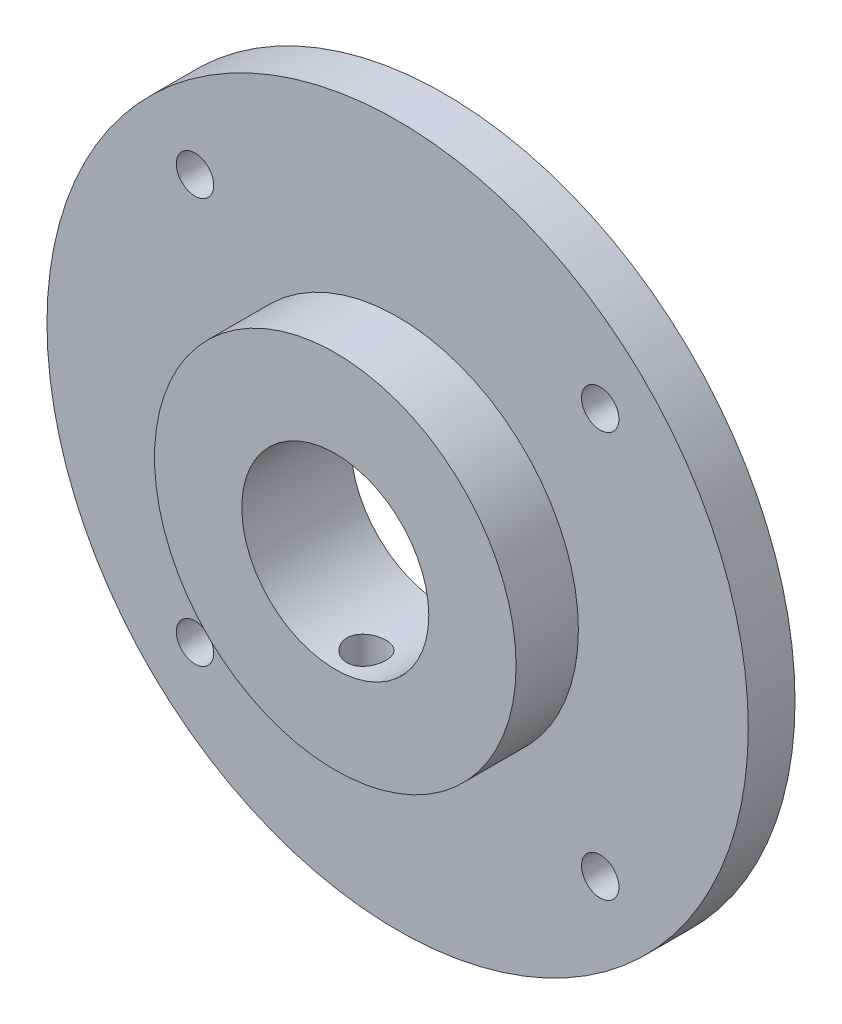
ISO-10303-21;
HEADER;
FILE_DESCRIPTION(('STEP AP214'),'2;1');
FILE_NAME('part.step','',(''),(''),'','','');
FILE_SCHEMA(('AUTOMOTIVE_DESIGN { 1 0 10303 214 1 1 1 1 }'));
ENDSEC;
DATA;
#1=APPLICATION_CONTEXT('core data for automotive mechanical design processes');
#2=APPLICATION_PROTOCOL_DEFINITION('international standard','automotive_design',2000,#1);
#3=PRODUCT_CONTEXT('',#1,'mechanical');
#4=PRODUCT('Part','Part','',(#3));
#5=PRODUCT_RELATED_PRODUCT_CATEGORY('part','',(#4));
#6=PRODUCT_DEFINITION_FORMATION('','',#4);
#7=PRODUCT_DEFINITION_CONTEXT('part definition',#1,'design');
#8=PRODUCT_DEFINITION('design','',#6,#7);
#9=PRODUCT_DEFINITION_SHAPE('','',#8);
#10=(LENGTH_UNIT() NAMED_UNIT(*) SI_UNIT(.MILLI.,.METRE.));
#11=(NAMED_UNIT(*) PLANE_ANGLE_UNIT() SI_UNIT($,.RADIAN.));
#12=(NAMED_UNIT(*) SI_UNIT($,.STERADIAN.) SOLID_ANGLE_UNIT());
#13=UNCERTAINTY_MEASURE_WITH_UNIT(LENGTH_MEASURE(1.E-05),#10,'distance_accuracy_value','');
#14=(GEOMETRIC_REPRESENTATION_CONTEXT(3) GLOBAL_UNCERTAINTY_ASSIGNED_CONTEXT((#13)) GLOBAL_UNIT_ASSIGNED_CONTEXT((#10,
#11,#12)) REPRESENTATION_CONTEXT('',''));
#15=CARTESIAN_POINT('',(0.,0.,0.));
#16=DIRECTION('',(0.,0.,1.));
#17=DIRECTION('',(1.,0.,0.));
#18=AXIS2_PLACEMENT_3D('',#15,#16,#17);
#19=CARTESIAN_POINT('',(5.44999999999901,10.5000000000004,7.2));
#20=DIRECTION('',(0.,0.,-1.));
#21=DIRECTION('',(-1.,0.,0.));
#22=AXIS2_PLACEMENT_3D('',#19,#20,#21);
#23=CYLINDRICAL_SURFACE('',#22,11.6);
#24=CARTESIAN_POINT('',(5.44999999999901,-1.09999999999963,6.25));
#25=CARTESIAN_POINT('',(5.51999533700662,-1.09999913909534,6.24999698414102));
#26=CARTESIAN_POINT('',(5.59003622514898,-1.09935974353205,6.24410098054191));
#27=CARTESIAN_POINT('',(5.72817413146121,-1.09687055638668,6.22067083736708));
#28=CARTESIAN_POINT('',(5.79626895634239,-1.09501945127631,6.20312406772643));
#29=CARTESIAN_POINT('',(5.92849451545237,-1.09031568143509,6.15691093620705));
#30=CARTESIAN_POINT('',(5.99262769398796,-1.08746364168106,6.12825151182667));
#31=CARTESIAN_POINT('',(6.1151601117815,-1.08107642052906,6.06064058602222));
#32=CARTESIAN_POINT('',(6.17356044315951,-1.07754136962858,6.02169105012624));
#33=CARTESIAN_POINT('',(6.28322505060999,-1.07016735079525,5.93443240990416));
#34=CARTESIAN_POINT('',(6.33446218062447,-1.06632730885086,5.88608927653775));
#35=CARTESIAN_POINT('',(6.42811248252506,-1.05878492070924,5.781488495025));
#36=CARTESIAN_POINT('',(6.4705252348429,-1.05508258106613,5.72523047076635));
#37=CARTESIAN_POINT('',(6.54542058366156,-1.04822396428384,5.60622486904517));
#38=CARTESIAN_POINT('',(6.57787833948106,-1.04506906153671,5.54346157226251));
#39=CARTESIAN_POINT('',(6.63178372408223,-1.03967614299403,5.41333576894798));
#40=CARTESIAN_POINT('',(6.65323166622358,-1.03743810110328,5.34597339337623));
#41=CARTESIAN_POINT('',(6.68442746674451,-1.03414220747002,5.20884011316874));
#42=CARTESIAN_POINT('',(6.69422062261861,-1.03307978769286,5.13907962469678));
#43=CARTESIAN_POINT('',(6.70196892377787,-1.0322413190753,4.99889772296499));
#44=CARTESIAN_POINT('',(6.69992442732175,-1.0324652313049,4.9284763297714));
#45=CARTESIAN_POINT('',(6.68409274956151,-1.03416995202075,4.78928485246713));
#46=CARTESIAN_POINT('',(6.67035515140598,-1.03564545320838,4.72050905458874));
#47=CARTESIAN_POINT('',(6.63160444135702,-1.03967881584656,4.58624487457389));
#48=CARTESIAN_POINT('',(6.60659115512832,-1.04223669403189,4.52075654328291));
#49=CARTESIAN_POINT('',(6.54594478743424,-1.04815268796088,4.39477038241008));
#50=CARTESIAN_POINT('',(6.51028983753168,-1.05151244868342,4.33428316009557));
#51=CARTESIAN_POINT('',(6.42938794828955,-1.05865229615894,4.22013234564498));
#52=CARTESIAN_POINT('',(6.38414068276848,-1.06243239720327,4.16646898564996));
#53=CARTESIAN_POINT('',(6.2850622461858,-1.07001064283307,4.06720116902675));
#54=CARTESIAN_POINT('',(6.23118827744613,-1.07380878062127,4.02163941700526));
#55=CARTESIAN_POINT('',(6.1165339675401,-1.08097690837796,3.94019957331797));
#56=CARTESIAN_POINT('',(6.05575361660819,-1.08434689774104,3.90432149534501));
#57=CARTESIAN_POINT('',(5.92898132579146,-1.09028039382145,3.84326866076262));
#58=CARTESIAN_POINT('',(5.86298826377034,-1.09284372629522,3.81809621623313));
#59=CARTESIAN_POINT('',(5.72767844536308,-1.0968733805983,3.77920124351773));
#60=CARTESIAN_POINT('',(5.65836180453735,-1.09833974053982,3.76547831753835));
#61=CARTESIAN_POINT('',(5.51874212889057,-1.10000531984257,3.74992643737613));
#62=CARTESIAN_POINT('',(5.44844572655148,-1.10021081406365,3.7480385834182));
#63=CARTESIAN_POINT('',(5.30853754397254,-1.09934836741802,3.75605552590914));
#64=CARTESIAN_POINT('',(5.23892575298107,-1.09828044658222,3.76596013686182));
#65=CARTESIAN_POINT('',(5.10253390593631,-1.09499514571276,3.79723196865486));
#66=CARTESIAN_POINT('',(5.03574742076722,-1.09278054621711,3.81857146581906));
#67=CARTESIAN_POINT('',(4.90670179650484,-1.08745017954791,3.87207873423338));
#68=CARTESIAN_POINT('',(4.8444427743081,-1.08433438911645,3.90424678495002));
#69=CARTESIAN_POINT('',(4.725954004709,-1.07753417468108,3.97864307427262));
#70=CARTESIAN_POINT('',(4.66974857333745,-1.07384759252494,4.02090983979928));
#71=CARTESIAN_POINT('',(4.56520895006475,-1.06632599269444,4.11424873231808));
#72=CARTESIAN_POINT('',(4.51687498834959,-1.06249097068331,4.16532111672375));
#73=CARTESIAN_POINT('',(4.42924453179657,-1.05508570058197,4.27507920558456));
#74=CARTESIAN_POINT('',(4.38998680614846,-1.0515166309095,4.33379595403951));
#75=CARTESIAN_POINT('',(4.32189009611166,-1.04506574212863,4.45702361725961));
#76=CARTESIAN_POINT('',(4.29305094962644,-1.0421839123281,4.52153444185864));
#77=CARTESIAN_POINT('',(4.24667433002203,-1.03744137126592,4.65438833767024));
#78=CARTESIAN_POINT('',(4.22911413747143,-1.0355786084065,4.72272340168739));
#79=CARTESIAN_POINT('',(4.20572032729194,-1.0330788924812,4.86139334075567));
#80=CARTESIAN_POINT('',(4.19988631401621,-1.03244189805735,4.93172814825331));
#81=CARTESIAN_POINT('',(4.20011646354266,-1.03246681390851,5.07201560492263));
#82=CARTESIAN_POINT('',(4.20611972615156,-1.03312207581038,5.14196836311109));
#83=CARTESIAN_POINT('',(4.22972596074652,-1.03564346396097,5.2798651600132));
#84=CARTESIAN_POINT('',(4.24732894282188,-1.03750959126288,5.34780919697963));
#85=CARTESIAN_POINT('',(4.29361746419193,-1.0422405405497,5.47975720247764));
#86=CARTESIAN_POINT('',(4.32230087873798,-1.0451051710545,5.54376192367366));
#87=CARTESIAN_POINT('',(4.38992989918408,-1.05151072475119,5.66605865432032));
#88=CARTESIAN_POINT('',(4.42887550155979,-1.05505164771083,5.72435066573287));
#89=CARTESIAN_POINT('',(4.51615146325082,-1.06243265368263,5.83387927626995));
#90=CARTESIAN_POINT('',(4.56452724301535,-1.06627412843251,5.88507959050539));
#91=CARTESIAN_POINT('',(4.66919843791631,-1.07381078694458,5.97866124276079));
#92=CARTESIAN_POINT('',(4.72549573806302,-1.07750593561796,6.021040475742));
#93=CARTESIAN_POINT('',(4.84459218978712,-1.08434489488504,6.09587566134801));
#94=CARTESIAN_POINT('',(4.90740957727063,-1.08748708905908,6.12830272040164));
#95=CARTESIAN_POINT('',(5.03759307025252,-1.0928489761686,6.18210418634773));
#96=CARTESIAN_POINT('',(5.1049540046877,-1.09506969791506,6.2034909261508));
#97=CARTESIAN_POINT('',(5.21890604013171,-1.09778688149641,6.2293326275717));
#98=CARTESIAN_POINT('',(5.26477132252117,-1.09861288172304,6.23707214750509));
#99=CARTESIAN_POINT('',(5.35708438004581,-1.09971972538161,6.24740682197864));
#100=CARTESIAN_POINT('',(5.40353215227872,-1.10000057152869,6.25000200214017));
#101=CARTESIAN_POINT('',(5.44999999999901,-1.09999999999963,6.25));
#102=B_SPLINE_CURVE_WITH_KNOTS('',3,(#24,#25,#26,#27,#28,#29,#30,#31,#32,#33,#34,#35,#36,#37,
#38,#39,#40,#41,#42,#43,#44,#45,#46,#47,#48,#49,#50,#51,#52,#53,#54,#55,#56,#57,#58,#59,#60,#61,
#62,#63,#64,#65,#66,#67,#68,#69,#70,#71,#72,#73,#74,#75,#76,#77,#78,#79,#80,#81,#82,#83,#84,#85,
#86,#87,#88,#89,#90,#91,#92,#93,#94,#95,#96,#97,#98,#99,#100,#101),.UNSPECIFIED.,.T.,.F.,(4,2,2,
2,2,2,2,2,2,2,2,2,2,2,2,2,2,2,2,2,2,2,2,2,2,2,2,2,2,2,2,2,2,2,2,2,2,2,4),(0.,0.209816314099416,
0.419860452673369,0.629773673761197,0.839646827994656,1.05029493638671,1.26095305807178,
1.47213263632785,1.68330620368901,1.89365631515188,2.10400006054102,2.31345628751777,
2.52291575304307,2.73280865307758,2.94270869155187,3.15368430254348,3.36466021185602,
3.57568166221646,3.78669578070094,3.99665890296916,4.20661872254815,4.41607178635394,
4.62553025620089,4.83580094799978,5.04607778765716,5.25723688192728,5.46839269075591,
5.67912181898861,5.88984383700132,6.09948456478155,6.30912547490511,6.51872620489081,
6.72832686289343,6.93896318483017,7.14964971496033,7.36094225585737,7.57199825270133,
7.71128983280416,7.85058071916343),.UNSPECIFIED.);
#103=CARTESIAN_POINT('',(5.44999999999901,-1.09999999999963,6.25));
#104=VERTEX_POINT('',#103);
#105=EDGE_CURVE('E169',#104,#104,#102,.T.);
#106=ORIENTED_EDGE('',*,*,#105,.T.);
#107=EDGE_LOOP('',(#106));
#108=FACE_BOUND('',#107,.T.);
#109=CARTESIAN_POINT('',(5.44999999999901,10.5000000000004,3.));
#110=DIRECTION('',(0.,0.,1.));
#111=DIRECTION('',(1.,0.,0.));
#112=AXIS2_PLACEMENT_3D('',#109,#110,#111);
#113=CIRCLE('',#112,11.6);
#114=CARTESIAN_POINT('',(17.049999999999,10.5000000000004,3.));
#115=VERTEX_POINT('',#114);
#116=EDGE_CURVE('E90',#115,#115,#113,.T.);
#117=ORIENTED_EDGE('',*,*,#116,.T.);
#118=EDGE_LOOP('',(#117));
#119=FACE_BOUND('',#118,.T.);
#120=CARTESIAN_POINT('',(5.44999999999901,10.5000000000004,7.));
#121=DIRECTION('',(0.,0.,1.));
#122=DIRECTION('',(1.,0.,0.));
#123=AXIS2_PLACEMENT_3D('',#120,#121,#122);
#124=CIRCLE('',#123,11.6);
#125=CARTESIAN_POINT('',(17.049999999999,10.5000000000004,7.));
#126=VERTEX_POINT('',#125);
#127=EDGE_CURVE('E191',#126,#126,#124,.T.);
#128=ORIENTED_EDGE('',*,*,#127,.F.);
#129=EDGE_LOOP('',(#128));
#130=FACE_BOUND('',#129,.T.);
#131=ADVANCED_FACE('F61',(#108,#119,#130),#23,.T.);
#132=CARTESIAN_POINT('',(18.45,-2.49999999999999,3.));
#133=DIRECTION('',(0.,0.,-1.));
#134=DIRECTION('',(-1.,0.,0.));
#135=AXIS2_PLACEMENT_3D('',#132,#133,#134);
#136=CYLINDRICAL_SURFACE('',#135,1.2);
#137=CARTESIAN_POINT('',(18.45,-2.49999999999999,3.));
#138=DIRECTION('',(0.,0.,1.));
#139=DIRECTION('',(1.,0.,0.));
#140=AXIS2_PLACEMENT_3D('',#137,#138,#139);
#141=CIRCLE('',#140,1.2);
#142=CARTESIAN_POINT('',(19.65,-2.49999999999999,3.));
#143=VERTEX_POINT('',#142);
#144=EDGE_CURVE('E75',#143,#143,#141,.T.);
#145=ORIENTED_EDGE('',*,*,#144,.T.);
#146=EDGE_LOOP('',(#145));
#147=FACE_BOUND('',#146,.T.);
#148=CARTESIAN_POINT('',(18.45,-2.49999999999999,0.));
#149=DIRECTION('',(0.,0.,1.));
#150=DIRECTION('',(1.,0.,0.));
#151=AXIS2_PLACEMENT_3D('',#148,#149,#150);
#152=CIRCLE('',#151,1.2);
#153=CARTESIAN_POINT('',(19.65,-2.49999999999999,0.));
#154=VERTEX_POINT('',#153);
#155=EDGE_CURVE('E102',#154,#154,#152,.T.);
#156=ORIENTED_EDGE('',*,*,#155,.F.);
#157=EDGE_LOOP('',(#156));
#158=FACE_BOUND('',#157,.T.);
#159=ADVANCED_FACE('F138',(#147,#158),#136,.F.);
#160=CARTESIAN_POINT('',(18.45,23.5,3.));
#161=DIRECTION('',(0.,0.,-1.));
#162=DIRECTION('',(-1.,0.,0.));
#163=AXIS2_PLACEMENT_3D('',#160,#161,#162);
#164=CYLINDRICAL_SURFACE('',#163,1.2);
#165=CARTESIAN_POINT('',(18.45,23.5,3.));
#166=DIRECTION('',(0.,0.,1.));
#167=DIRECTION('',(1.,0.,0.));
#168=AXIS2_PLACEMENT_3D('',#165,#166,#167);
#169=CIRCLE('',#168,1.2);
#170=CARTESIAN_POINT('',(19.65,23.5,3.));
#171=VERTEX_POINT('',#170);
#172=EDGE_CURVE('E81',#171,#171,#169,.T.);
#173=ORIENTED_EDGE('',*,*,#172,.T.);
#174=EDGE_LOOP('',(#173));
#175=FACE_BOUND('',#174,.T.);
#176=CARTESIAN_POINT('',(18.45,23.5,0.));
#177=DIRECTION('',(0.,0.,1.));
#178=DIRECTION('',(1.,0.,0.));
#179=AXIS2_PLACEMENT_3D('',#176,#177,#178);
#180=CIRCLE('',#179,1.2);
#181=CARTESIAN_POINT('',(19.65,23.5,0.));
#182=VERTEX_POINT('',#181);
#183=EDGE_CURVE('E98',#182,#182,#180,.T.);
#184=ORIENTED_EDGE('',*,*,#183,.F.);
#185=EDGE_LOOP('',(#184));
#186=FACE_BOUND('',#185,.T.);
#187=ADVANCED_FACE('F126',(#175,#186),#164,.F.);
#188=CARTESIAN_POINT('',(-7.54999999999997,23.5,3.));
#189=DIRECTION('',(0.,0.,-1.));
#190=DIRECTION('',(-1.,0.,0.));
#191=AXIS2_PLACEMENT_3D('',#188,#189,#190);
#192=CYLINDRICAL_SURFACE('',#191,1.2);
#193=CARTESIAN_POINT('',(-7.54999999999997,23.5,3.));
#194=DIRECTION('',(0.,0.,1.));
#195=DIRECTION('',(1.,0.,0.));
#196=AXIS2_PLACEMENT_3D('',#193,#194,#195);
#197=CIRCLE('',#196,1.2);
#198=CARTESIAN_POINT('',(-6.34999999999997,23.5,3.));
#199=VERTEX_POINT('',#198);
#200=EDGE_CURVE('E113',#199,#199,#197,.T.);
#201=ORIENTED_EDGE('',*,*,#200,.T.);
#202=EDGE_LOOP('',(#201));
#203=FACE_BOUND('',#202,.T.);
#204=CARTESIAN_POINT('',(-7.54999999999997,23.5,0.));
#205=DIRECTION('',(0.,0.,1.));
#206=DIRECTION('',(1.,0.,0.));
#207=AXIS2_PLACEMENT_3D('',#204,#205,#206);
#208=CIRCLE('',#207,1.2);
#209=CARTESIAN_POINT('',(-6.34999999999997,23.5,0.));
#210=VERTEX_POINT('',#209);
#211=EDGE_CURVE('E94',#210,#210,#208,.T.);
#212=ORIENTED_EDGE('',*,*,#211,.F.);
#213=EDGE_LOOP('',(#212));
#214=FACE_BOUND('',#213,.T.);
#215=ADVANCED_FACE('F201',(#203,#214),#192,.F.);
#216=CARTESIAN_POINT('',(-7.54999999999996,-2.49999999999999,3.));
#217=DIRECTION('',(0.,0.,-1.));
#218=DIRECTION('',(-1.,0.,0.));
#219=AXIS2_PLACEMENT_3D('',#216,#217,#218);
#220=CYLINDRICAL_SURFACE('',#219,1.2);
#221=CARTESIAN_POINT('',(-7.54999999999996,-2.49999999999999,3.));
#222=DIRECTION('',(0.,0.,1.));
#223=DIRECTION('',(1.,0.,0.));
#224=AXIS2_PLACEMENT_3D('',#221,#222,#223);
#225=CIRCLE('',#224,1.2);
#226=CARTESIAN_POINT('',(-6.34999999999997,-2.49999999999999,3.));
#227=VERTEX_POINT('',#226);
#228=EDGE_CURVE('E108',#227,#227,#225,.T.);
#229=ORIENTED_EDGE('',*,*,#228,.T.);
#230=EDGE_LOOP('',(#229));
#231=FACE_BOUND('',#230,.T.);
#232=CARTESIAN_POINT('',(-7.54999999999996,-2.49999999999999,0.));
#233=DIRECTION('',(0.,0.,1.));
#234=DIRECTION('',(1.,0.,0.));
#235=AXIS2_PLACEMENT_3D('',#232,#233,#234);
#236=CIRCLE('',#235,1.2);
#237=CARTESIAN_POINT('',(-6.34999999999997,-2.49999999999999,0.));
#238=VERTEX_POINT('',#237);
#239=EDGE_CURVE('E89',#238,#238,#236,.T.);
#240=ORIENTED_EDGE('',*,*,#239,.F.);
#241=EDGE_LOOP('',(#240));
#242=FACE_BOUND('',#241,.T.);
#243=ADVANCED_FACE('F204',(#231,#242),#220,.F.);
#244=CARTESIAN_POINT('',(5.45000000000004,10.5,3.));
#245=DIRECTION('',(0.,0.,-1.));
#246=DIRECTION('',(-1.,0.,0.));
#247=AXIS2_PLACEMENT_3D('',#244,#245,#246);
#248=CYLINDRICAL_SURFACE('',#247,6.);
#249=CARTESIAN_POINT('',(5.44999999999901,4.50000000000003,6.25));
#250=CARTESIAN_POINT('',(5.51940904170067,4.50000128473351,6.24999752253078));
#251=CARTESIAN_POINT('',(5.58884878951989,4.50121671224958,6.24419933428125));
#252=CARTESIAN_POINT('',(5.725761316266,4.50594799009319,6.22118065046715));
#253=CARTESIAN_POINT('',(5.79323256012732,4.5094655881075,6.20395147696307));
#254=CARTESIAN_POINT('',(5.92420913229035,4.51840890803794,6.15862954507819));
#255=CARTESIAN_POINT('',(5.98771833670819,4.52383272947349,6.13054760400112));
#256=CARTESIAN_POINT('',(6.10912032860497,4.53600072190134,6.06435039114382));
#257=CARTESIAN_POINT('',(6.16701336753333,4.54274483374016,6.02623556884417));
#258=CARTESIAN_POINT('',(6.27639032430784,4.55692299975339,5.94046365980936));
#259=CARTESIAN_POINT('',(6.32778024416169,4.56436494151457,5.89268799876493));
#260=CARTESIAN_POINT('',(6.4218777767684,4.57904342307538,5.7892053408049));
#261=CARTESIAN_POINT('',(6.46458467095999,4.58627994583303,5.73349768812775));
#262=CARTESIAN_POINT('',(6.54051031677117,4.59980557404676,5.61504803123386));
#263=CARTESIAN_POINT('',(6.57363054680551,4.60608454825156,5.55224161549728));
#264=CARTESIAN_POINT('',(6.62881119347964,4.61687159349963,5.42180254822727));
#265=CARTESIAN_POINT('',(6.65087280167542,4.62137985532414,5.35417041755749));
#266=CARTESIAN_POINT('',(6.68300240133638,4.62803499013859,5.21701476258439));
#267=CARTESIAN_POINT('',(6.693235976967,4.63021443144116,5.14753164066526));
#268=CARTESIAN_POINT('',(6.70193357655516,4.63206309283491,5.00780315713739));
#269=CARTESIAN_POINT('',(6.70039890894588,4.63173259199,4.93755788113473));
#270=CARTESIAN_POINT('',(6.68573719037099,4.62862825680807,4.79951897202484));
#271=CARTESIAN_POINT('',(6.67280105232622,4.62589466320081,4.7317040203388));
#272=CARTESIAN_POINT('',(6.63600543529847,4.61835562384041,4.59922849035508));
#273=CARTESIAN_POINT('',(6.61214539481283,4.61355007158666,4.53456807439368));
#274=CARTESIAN_POINT('',(6.5540000321383,4.60236808535882,4.40969277158402));
#275=CARTESIAN_POINT('',(6.51964002534138,4.59598046214399,4.34951370347293));
#276=CARTESIAN_POINT('',(6.44152269927383,4.58236109989265,4.23570425573184));
#277=CARTESIAN_POINT('',(6.3977642122616,4.5751292560145,4.18207469116402));
#278=CARTESIAN_POINT('',(6.30107492154579,4.5604626907008,4.08178603891962));
#279=CARTESIAN_POINT('',(6.24798143341109,4.55302676800516,4.03528383110298));
#280=CARTESIAN_POINT('',(6.1346672886108,4.5389191185699,3.95181955777102));
#281=CARTESIAN_POINT('',(6.07444652502477,4.53224740329757,3.9148576354016));
#282=CARTESIAN_POINT('',(5.94840554123448,4.5204012905718,3.85148991846404));
#283=CARTESIAN_POINT('',(5.88257546192551,4.51522960289738,3.82510319543288));
#284=CARTESIAN_POINT('',(5.74728462097116,4.50698661788718,3.78380829516451));
#285=CARTESIAN_POINT('',(5.6778243385941,4.50391504403946,3.7688986067686));
#286=CARTESIAN_POINT('',(5.53859186569985,4.50025724784546,3.75120574793211));
#287=CARTESIAN_POINT('',(5.46884805552519,4.49962706462424,3.74820805850575));
#288=CARTESIAN_POINT('',(5.32985620124131,4.50080047747232,3.7538449499691));
#289=CARTESIAN_POINT('',(5.26060812703676,4.50260392451853,3.7624788186016));
#290=CARTESIAN_POINT('',(5.12527363287921,4.50841435020825,3.79095565346953));
#291=CARTESIAN_POINT('',(5.05916280710482,4.51239947131933,3.81068748538346));
#292=CARTESIAN_POINT('',(4.93118855333769,4.52212772757618,3.8606778604214));
#293=CARTESIAN_POINT('',(4.86932546366225,4.52787100255435,3.89093724086597));
#294=CARTESIAN_POINT('',(4.75070569305553,4.54058758509301,3.96158037823755));
#295=CARTESIAN_POINT('',(4.69402678052919,4.54757606187687,4.00209192956905));
#296=CARTESIAN_POINT('',(4.5881945541125,4.5619743170031,4.09191956307626));
#297=CARTESIAN_POINT('',(4.53904212208573,4.56938414457508,4.14123667551894));
#298=CARTESIAN_POINT('',(4.44882135134722,4.58393975468644,4.2482555769997));
#299=CARTESIAN_POINT('',(4.40790085399697,4.5910791069252,4.30608303195528));
#300=CARTESIAN_POINT('',(4.33635280920658,4.60414398984218,4.42791628421379));
#301=CARTESIAN_POINT('',(4.30572483322037,4.61006957105373,4.49192182413911));
#302=CARTESIAN_POINT('',(4.25582753555979,4.61998299291983,4.62396119629823));
#303=CARTESIAN_POINT('',(4.2364969017187,4.62398127215338,4.69197103716584));
#304=CARTESIAN_POINT('',(4.20955961476494,4.62960815290328,4.83036655049226));
#305=CARTESIAN_POINT('',(4.2019512845546,4.63123709339658,4.90075188161944));
#306=CARTESIAN_POINT('',(4.1987407351229,4.63192092691519,5.04041340099965));
#307=CARTESIAN_POINT('',(4.20290457377176,4.63102597678524,5.10968407022206));
#308=CARTESIAN_POINT('',(4.2226009468587,4.62687552745098,5.24651400892022));
#309=CARTESIAN_POINT('',(4.23813337217635,4.62362005090399,5.3140732948161));
#310=CARTESIAN_POINT('',(4.28001782231316,4.61513867552308,5.44539777189065));
#311=CARTESIAN_POINT('',(4.3063388243148,4.60991842992094,5.50917324648691));
#312=CARTESIAN_POINT('',(4.36902542700143,4.59809294261285,5.63143877602665));
#313=CARTESIAN_POINT('',(4.4053919601687,4.59148757234562,5.68992833963311));
#314=CARTESIAN_POINT('',(4.48792630465659,4.57748420448875,5.80112162707943));
#315=CARTESIAN_POINT('',(4.53426210958077,4.57007386131615,5.85369912456497));
#316=CARTESIAN_POINT('',(4.63507556188366,4.55538160416805,5.95040949322634));
#317=CARTESIAN_POINT('',(4.68955508116602,4.54809972015137,5.99454041755147));
#318=CARTESIAN_POINT('',(4.80586557249128,4.53438555452377,6.07358857318404));
#319=CARTESIAN_POINT('',(4.86777407847764,4.5279640392677,6.10839367988627));
#320=CARTESIAN_POINT('',(4.99668015600053,4.51680091505919,6.16705022843001));
#321=CARTESIAN_POINT('',(5.06367321809174,4.51205783817909,6.19091124718187));
#322=CARTESIAN_POINT('',(5.18398470709888,4.50567500218565,6.22254027828842));
#323=CARTESIAN_POINT('',(5.23663240627106,4.50355964338612,6.23281876320886));
#324=CARTESIAN_POINT('',(5.34284732582247,4.50072167210247,6.24654945427733));
#325=CARTESIAN_POINT('',(5.39641451215014,4.49999900815418,6.25000191266719));
#326=CARTESIAN_POINT('',(5.44999999999901,4.50000000000003,6.25));
#327=B_SPLINE_CURVE_WITH_KNOTS('',3,(#249,#250,#251,#252,#253,#254,#255,#256,#257,#258,#259,
#260,#261,#262,#263,#264,#265,#266,#267,#268,#269,#270,#271,#272,#273,#274,#275,#276,#277,#278,
#279,#280,#281,#282,#283,#284,#285,#286,#287,#288,#289,#290,#291,#292,#293,#294,#295,#296,#297,
#298,#299,#300,#301,#302,#303,#304,#305,#306,#307,#308,#309,#310,#311,#312,#313,#314,#315,#316,
#317,#318,#319,#320,#321,#322,#323,#324,#325,#326),.UNSPECIFIED.,.T.,.F.,(4,2,2,2,2,2,2,2,2,2,2,
2,2,2,2,2,2,2,2,2,2,2,2,2,2,2,2,2,2,2,2,2,2,2,2,2,2,2,4),(0.,0.208031045103179,
0.416220199906216,0.624202378825431,0.832175241572974,1.0428752638812,1.25359271551783,
1.46640449178545,1.67919333285486,1.88896575169851,2.09871484767161,2.30501712129057,
2.51133000030278,2.71914592416748,2.92698768368033,3.13889526355465,3.35080602278217,
3.56309724499661,3.77536051045769,3.98378339407672,4.19219351552274,4.39855286632618,
4.6049286339093,4.81401583995734,5.02312752564572,5.23571263829335,5.44828889851308,
5.65970050095024,5.87108185414184,6.07829223291037,6.28550062281359,6.49211731393253,
6.69875319081477,6.90919024830305,7.11967575117366,7.33258864398253,7.54531486464971,
7.70592588477279,7.86653096973392),.UNSPECIFIED.);
#328=CARTESIAN_POINT('',(5.44999999999901,4.50000000000003,6.25));
#329=VERTEX_POINT('',#328);
#330=EDGE_CURVE('E66',#329,#329,#327,.T.);
#331=ORIENTED_EDGE('',*,*,#330,.F.);
#332=EDGE_LOOP('',(#331));
#333=FACE_BOUND('',#332,.T.);
#334=CARTESIAN_POINT('',(5.45000000000004,10.5,0.));
#335=DIRECTION('',(0.,0.,1.));
#336=DIRECTION('',(1.,0.,0.));
#337=AXIS2_PLACEMENT_3D('',#334,#335,#336);
#338=CIRCLE('',#337,6.);
#339=CARTESIAN_POINT('',(11.45,10.5,0.));
#340=VERTEX_POINT('',#339);
#341=EDGE_CURVE('E85',#340,#340,#338,.T.);
#342=ORIENTED_EDGE('',*,*,#341,.F.);
#343=EDGE_LOOP('',(#342));
#344=FACE_BOUND('',#343,.T.);
#345=CARTESIAN_POINT('',(5.45000000000004,10.5,7.));
#346=DIRECTION('',(0.,0.,1.));
#347=DIRECTION('',(1.,0.,0.));
#348=AXIS2_PLACEMENT_3D('',#345,#346,#347);
#349=CIRCLE('',#348,6.);
#350=CARTESIAN_POINT('',(11.45,10.5,7.));
#351=VERTEX_POINT('',#350);
#352=EDGE_CURVE('E175',#351,#351,#349,.T.);
#353=ORIENTED_EDGE('',*,*,#352,.T.);
#354=EDGE_LOOP('',(#353));
#355=FACE_BOUND('',#354,.T.);
#356=ADVANCED_FACE('F63',(#333,#344,#355),#248,.F.);
#357=CARTESIAN_POINT('',(5.44999999999901,10.5000000000004,3.));
#358=DIRECTION('',(0.,0.,-1.));
#359=DIRECTION('',(-1.,0.,0.));
#360=AXIS2_PLACEMENT_3D('',#357,#358,#359);
#361=CYLINDRICAL_SURFACE('',#360,22.5);
#362=CARTESIAN_POINT('',(5.44999999999901,10.5000000000004,3.));
#363=DIRECTION('',(0.,0.,1.));
#364=DIRECTION('',(1.,0.,0.));
#365=AXIS2_PLACEMENT_3D('',#362,#363,#364);
#366=CIRCLE('',#365,22.5);
#367=CARTESIAN_POINT('',(27.949999999999,10.5000000000004,3.));
#368=VERTEX_POINT('',#367);
#369=EDGE_CURVE('E13',#368,#368,#366,.T.);
#370=ORIENTED_EDGE('',*,*,#369,.F.);
#371=EDGE_LOOP('',(#370));
#372=FACE_BOUND('',#371,.T.);
#373=CARTESIAN_POINT('',(5.44999999999901,10.5000000000004,0.));
#374=DIRECTION('',(0.,0.,1.));
#375=DIRECTION('',(1.,0.,0.));
#376=AXIS2_PLACEMENT_3D('',#373,#374,#375);
#377=CIRCLE('',#376,22.5);
#378=CARTESIAN_POINT('',(27.949999999999,10.5000000000004,0.));
#379=VERTEX_POINT('',#378);
#380=EDGE_CURVE('E105',#379,#379,#377,.T.);
#381=ORIENTED_EDGE('',*,*,#380,.T.);
#382=EDGE_LOOP('',(#381));
#383=FACE_BOUND('',#382,.T.);
#384=ADVANCED_FACE('F133',(#372,#383),#361,.T.);
#385=CARTESIAN_POINT('',(0.,0.,3.));
#386=DIRECTION('',(0.,0.,1.));
#387=DIRECTION('',(1.,0.,0.));
#388=AXIS2_PLACEMENT_3D('',#385,#386,#387);
#389=PLANE('',#388);
#390=ORIENTED_EDGE('',*,*,#116,.F.);
#391=EDGE_LOOP('',(#390));
#392=FACE_BOUND('',#391,.T.);
#393=ORIENTED_EDGE('',*,*,#228,.F.);
#394=EDGE_LOOP('',(#393));
#395=FACE_BOUND('',#394,.T.);
#396=ORIENTED_EDGE('',*,*,#200,.F.);
#397=EDGE_LOOP('',(#396));
#398=FACE_BOUND('',#397,.T.);
#399=ORIENTED_EDGE('',*,*,#172,.F.);
#400=EDGE_LOOP('',(#399));
#401=FACE_BOUND('',#400,.T.);
#402=ORIENTED_EDGE('',*,*,#144,.F.);
#403=EDGE_LOOP('',(#402));
#404=FACE_BOUND('',#403,.T.);
#405=ORIENTED_EDGE('',*,*,#369,.T.);
#406=EDGE_LOOP('',(#405));
#407=FACE_BOUND('',#406,.T.);
#408=ADVANCED_FACE('F129',(#392,#395,#398,#401,#404,#407),#389,.T.);
#409=CARTESIAN_POINT('',(0.,0.,0.));
#410=DIRECTION('',(0.,0.,1.));
#411=DIRECTION('',(1.,0.,0.));
#412=AXIS2_PLACEMENT_3D('',#409,#410,#411);
#413=PLANE('',#412);
#414=ORIENTED_EDGE('',*,*,#341,.T.);
#415=EDGE_LOOP('',(#414));
#416=FACE_BOUND('',#415,.T.);
#417=ORIENTED_EDGE('',*,*,#239,.T.);
#418=EDGE_LOOP('',(#417));
#419=FACE_BOUND('',#418,.T.);
#420=ORIENTED_EDGE('',*,*,#211,.T.);
#421=EDGE_LOOP('',(#420));
#422=FACE_BOUND('',#421,.T.);
#423=ORIENTED_EDGE('',*,*,#183,.T.);
#424=EDGE_LOOP('',(#423));
#425=FACE_BOUND('',#424,.T.);
#426=ORIENTED_EDGE('',*,*,#155,.T.);
#427=EDGE_LOOP('',(#426));
#428=FACE_BOUND('',#427,.T.);
#429=ORIENTED_EDGE('',*,*,#380,.F.);
#430=EDGE_LOOP('',(#429));
#431=FACE_BOUND('',#430,.T.);
#432=ADVANCED_FACE('F132',(#416,#419,#422,#425,#428,#431),#413,.F.);
#433=CARTESIAN_POINT('',(5.44999999999901,10.5000000000004,7.));
#434=DIRECTION('',(0.,0.,1.));
#435=DIRECTION('',(1.,0.,0.));
#436=AXIS2_PLACEMENT_3D('',#433,#434,#435);
#437=PLANE('',#436);
#438=ORIENTED_EDGE('',*,*,#127,.T.);
#439=EDGE_LOOP('',(#438));
#440=FACE_BOUND('',#439,.T.);
#441=ORIENTED_EDGE('',*,*,#352,.F.);
#442=EDGE_LOOP('',(#441));
#443=FACE_BOUND('',#442,.T.);
#444=ADVANCED_FACE('F146',(#440,#443),#437,.T.);
#445=CARTESIAN_POINT('',(5.44999999999901,-10.,5.));
#446=DIRECTION('',(0.,1.,0.));
#447=DIRECTION('',(0.,0.,1.));
#448=AXIS2_PLACEMENT_3D('',#445,#446,#447);
#449=CYLINDRICAL_SURFACE('',#448,1.25);
#450=ORIENTED_EDGE('',*,*,#330,.T.);
#451=EDGE_LOOP('',(#450));
#452=FACE_BOUND('',#451,.T.);
#453=ORIENTED_EDGE('',*,*,#105,.F.);
#454=EDGE_LOOP('',(#453));
#455=FACE_BOUND('',#454,.T.);
#456=ADVANCED_FACE('F153',(#452,#455),#449,.F.);
#457=CLOSED_SHELL('',(#131,#159,#187,#215,#243,#356,#384,#408,#432,#444,#456));
#458=MANIFOLD_SOLID_BREP('B2',#457);
#459=ADVANCED_BREP_SHAPE_REPRESENTATION('',(#18,#458),#14);
#460=SHAPE_DEFINITION_REPRESENTATION(#9,#459);
ENDSEC;
END-ISO-10303-21;
